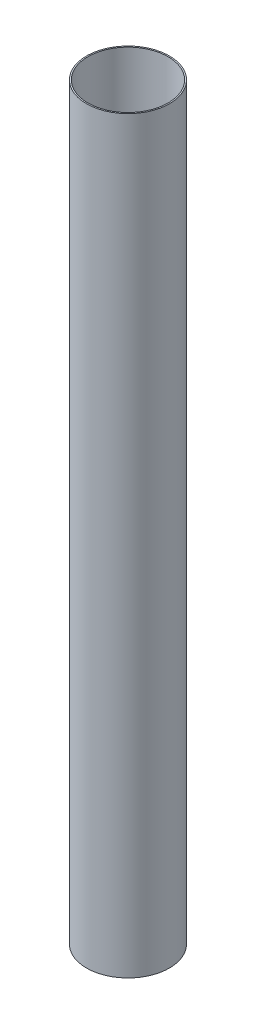
ISO-10303-21;
HEADER;
FILE_DESCRIPTION(('STEP AP214'),'2;1');
FILE_NAME('part.step','',(''),(''),'','','');
FILE_SCHEMA(('AUTOMOTIVE_DESIGN { 1 0 10303 214 1 1 1 1 }'));
ENDSEC;
DATA;
#1=APPLICATION_CONTEXT('core data for automotive mechanical design processes');
#2=APPLICATION_PROTOCOL_DEFINITION('international standard','automotive_design',2000,#1);
#3=PRODUCT_CONTEXT('',#1,'mechanical');
#4=PRODUCT('Part','Part','',(#3));
#5=PRODUCT_RELATED_PRODUCT_CATEGORY('part','',(#4));
#6=PRODUCT_DEFINITION_FORMATION('','',#4);
#7=PRODUCT_DEFINITION_CONTEXT('part definition',#1,'design');
#8=PRODUCT_DEFINITION('design','',#6,#7);
#9=PRODUCT_DEFINITION_SHAPE('','',#8);
#10=(LENGTH_UNIT() NAMED_UNIT(*) SI_UNIT(.MILLI.,.METRE.));
#11=(NAMED_UNIT(*) PLANE_ANGLE_UNIT() SI_UNIT($,.RADIAN.));
#12=(NAMED_UNIT(*) SI_UNIT($,.STERADIAN.) SOLID_ANGLE_UNIT());
#13=UNCERTAINTY_MEASURE_WITH_UNIT(LENGTH_MEASURE(1.E-05),#10,'distance_accuracy_value','');
#14=(GEOMETRIC_REPRESENTATION_CONTEXT(3) GLOBAL_UNCERTAINTY_ASSIGNED_CONTEXT((#13)) GLOBAL_UNIT_ASSIGNED_CONTEXT((#10,
#11,#12)) REPRESENTATION_CONTEXT('',''));
#15=CARTESIAN_POINT('',(0.,0.,0.));
#16=DIRECTION('',(0.,0.,1.));
#17=DIRECTION('',(1.,0.,0.));
#18=AXIS2_PLACEMENT_3D('',#15,#16,#17);
#19=CARTESIAN_POINT('',(0.,711.2,0.));
#20=DIRECTION('',(0.,1.,0.));
#21=DIRECTION('',(0.,0.,1.));
#22=AXIS2_PLACEMENT_3D('',#19,#20,#21);
#23=PLANE('',#22);
#24=CARTESIAN_POINT('',(0.,711.2,0.));
#25=DIRECTION('',(0.,1.,0.));
#26=DIRECTION('',(0.,0.,1.));
#27=AXIS2_PLACEMENT_3D('',#24,#25,#26);
#28=CIRCLE('',#27,39.37);
#29=CARTESIAN_POINT('',(0.,711.2,39.37));
#30=VERTEX_POINT('',#29);
#31=EDGE_CURVE('E10',#30,#30,#28,.T.);
#32=ORIENTED_EDGE('',*,*,#31,.T.);
#33=EDGE_LOOP('',(#32));
#34=FACE_BOUND('',#33,.T.);
#35=CARTESIAN_POINT('',(0.,711.2,0.));
#36=DIRECTION('',(0.,1.,0.));
#37=DIRECTION('',(0.,0.,1.));
#38=AXIS2_PLACEMENT_3D('',#35,#36,#37);
#39=CIRCLE('',#38,38.1);
#40=CARTESIAN_POINT('',(0.,711.2,38.1));
#41=VERTEX_POINT('',#40);
#42=EDGE_CURVE('E50',#41,#41,#39,.T.);
#43=ORIENTED_EDGE('',*,*,#42,.F.);
#44=EDGE_LOOP('',(#43));
#45=FACE_BOUND('',#44,.T.);
#46=ADVANCED_FACE('F37',(#34,#45),#23,.T.);
#47=CARTESIAN_POINT('',(0.,0.,0.));
#48=DIRECTION('',(0.,1.,0.));
#49=DIRECTION('',(0.,0.,1.));
#50=AXIS2_PLACEMENT_3D('',#47,#48,#49);
#51=PLANE('',#50);
#52=CARTESIAN_POINT('',(0.,0.,0.));
#53=DIRECTION('',(0.,1.,0.));
#54=DIRECTION('',(0.,0.,1.));
#55=AXIS2_PLACEMENT_3D('',#52,#53,#54);
#56=CIRCLE('',#55,39.37);
#57=CARTESIAN_POINT('',(0.,0.,39.37));
#58=VERTEX_POINT('',#57);
#59=EDGE_CURVE('E41',#58,#58,#56,.T.);
#60=ORIENTED_EDGE('',*,*,#59,.F.);
#61=EDGE_LOOP('',(#60));
#62=FACE_BOUND('',#61,.T.);
#63=CARTESIAN_POINT('',(0.,0.,0.));
#64=DIRECTION('',(0.,1.,0.));
#65=DIRECTION('',(0.,0.,1.));
#66=AXIS2_PLACEMENT_3D('',#63,#64,#65);
#67=CIRCLE('',#66,38.1);
#68=CARTESIAN_POINT('',(0.,0.,38.1));
#69=VERTEX_POINT('',#68);
#70=EDGE_CURVE('E52',#69,#69,#67,.T.);
#71=ORIENTED_EDGE('',*,*,#70,.T.);
#72=EDGE_LOOP('',(#71));
#73=FACE_BOUND('',#72,.T.);
#74=ADVANCED_FACE('F64',(#62,#73),#51,.F.);
#75=CARTESIAN_POINT('',(0.,711.2,0.));
#76=DIRECTION('',(0.,-1.,0.));
#77=DIRECTION('',(0.,0.,-1.));
#78=AXIS2_PLACEMENT_3D('',#75,#76,#77);
#79=CYLINDRICAL_SURFACE('',#78,39.37);
#80=ORIENTED_EDGE('',*,*,#31,.F.);
#81=EDGE_LOOP('',(#80));
#82=FACE_BOUND('',#81,.T.);
#83=ORIENTED_EDGE('',*,*,#59,.T.);
#84=EDGE_LOOP('',(#83));
#85=FACE_BOUND('',#84,.T.);
#86=ADVANCED_FACE('F39',(#82,#85),#79,.T.);
#87=CARTESIAN_POINT('',(0.,711.2,0.));
#88=DIRECTION('',(0.,-1.,0.));
#89=DIRECTION('',(0.,0.,-1.));
#90=AXIS2_PLACEMENT_3D('',#87,#88,#89);
#91=CYLINDRICAL_SURFACE('',#90,38.1);
#92=ORIENTED_EDGE('',*,*,#42,.T.);
#93=EDGE_LOOP('',(#92));
#94=FACE_BOUND('',#93,.T.);
#95=ORIENTED_EDGE('',*,*,#70,.F.);
#96=EDGE_LOOP('',(#95));
#97=FACE_BOUND('',#96,.T.);
#98=ADVANCED_FACE('F60',(#94,#97),#91,.F.);
#99=CLOSED_SHELL('',(#46,#74,#86,#98));
#100=MANIFOLD_SOLID_BREP('B2',#99);
#101=ADVANCED_BREP_SHAPE_REPRESENTATION('',(#18,#100),#14);
#102=SHAPE_DEFINITION_REPRESENTATION(#9,#101);
ENDSEC;
END-ISO-10303-21;
